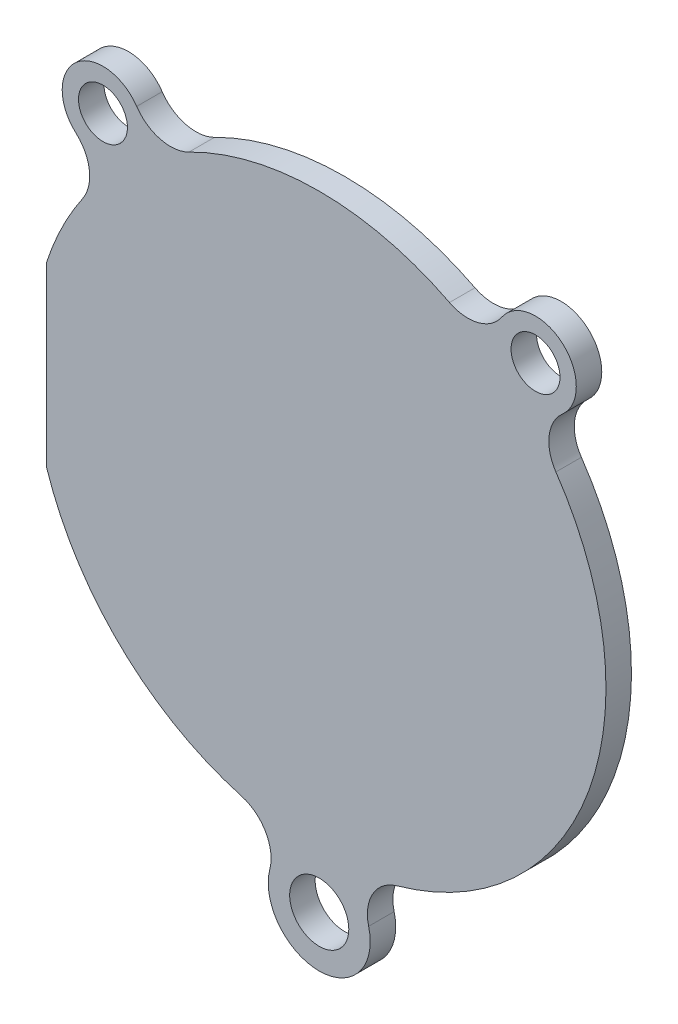
ISO-10303-21;
HEADER;
FILE_DESCRIPTION(('STEP AP214'),'2;1');
FILE_NAME('part.step','',(''),(''),'','','');
FILE_SCHEMA(('AUTOMOTIVE_DESIGN { 1 0 10303 214 1 1 1 1 }'));
ENDSEC;
DATA;
#1=APPLICATION_CONTEXT('core data for automotive mechanical design processes');
#2=APPLICATION_PROTOCOL_DEFINITION('international standard','automotive_design',2000,#1);
#3=PRODUCT_CONTEXT('',#1,'mechanical');
#4=PRODUCT('Part','Part','',(#3));
#5=PRODUCT_RELATED_PRODUCT_CATEGORY('part','',(#4));
#6=PRODUCT_DEFINITION_FORMATION('','',#4);
#7=PRODUCT_DEFINITION_CONTEXT('part definition',#1,'design');
#8=PRODUCT_DEFINITION('design','',#6,#7);
#9=PRODUCT_DEFINITION_SHAPE('','',#8);
#10=(LENGTH_UNIT() NAMED_UNIT(*) SI_UNIT(.MILLI.,.METRE.));
#11=(NAMED_UNIT(*) PLANE_ANGLE_UNIT() SI_UNIT($,.RADIAN.));
#12=(NAMED_UNIT(*) SI_UNIT($,.STERADIAN.) SOLID_ANGLE_UNIT());
#13=UNCERTAINTY_MEASURE_WITH_UNIT(LENGTH_MEASURE(1.E-05),#10,'distance_accuracy_value','');
#14=(GEOMETRIC_REPRESENTATION_CONTEXT(3) GLOBAL_UNCERTAINTY_ASSIGNED_CONTEXT((#13)) GLOBAL_UNIT_ASSIGNED_CONTEXT((#10,
#11,#12)) REPRESENTATION_CONTEXT('',''));
#15=CARTESIAN_POINT('',(0.,0.,0.));
#16=DIRECTION('',(0.,0.,1.));
#17=DIRECTION('',(1.,0.,0.));
#18=AXIS2_PLACEMENT_3D('',#15,#16,#17);
#19=CARTESIAN_POINT('',(-16.8382353602383,11.5166142635726,1.5875));
#20=DIRECTION('',(0.,0.,1.));
#21=DIRECTION('',(1.,0.,0.));
#22=AXIS2_PLACEMENT_3D('',#19,#20,#21);
#23=PLANE('',#22);
#24=CARTESIAN_POINT('',(-13.4706067024938,15.3199650524873,1.5875));
#25=DIRECTION('',(0.,0.,1.));
#26=DIRECTION('',(1.,0.,0.));
#27=AXIS2_PLACEMENT_3D('',#24,#25,#26);
#28=CIRCLE('',#27,1.524);
#29=CARTESIAN_POINT('',(-11.9466067024938,15.3199650524873,1.5875));
#30=VERTEX_POINT('',#29);
#31=EDGE_CURVE('E313',#30,#30,#28,.T.);
#32=ORIENTED_EDGE('',*,*,#31,.F.);
#33=EDGE_LOOP('',(#32));
#34=FACE_BOUND('',#33,.T.);
#35=CARTESIAN_POINT('',(-16.8382353602383,11.5166142635726,1.5875));
#36=DIRECTION('',(0.,0.,-1.));
#37=DIRECTION('',(1.,0.,0.));
#38=AXIS2_PLACEMENT_3D('',#35,#36,#37);
#39=CIRCLE('',#38,2.54);
#40=CARTESIAN_POINT('',(-15.1544210313661,13.41828965803,1.5875));
#41=VERTEX_POINT('',#40);
#42=CARTESIAN_POINT('',(-14.741706385558,10.0826804232836,1.5875));
#43=VERTEX_POINT('',#42);
#44=EDGE_CURVE('E193',#41,#43,#39,.T.);
#45=ORIENTED_EDGE('',*,*,#44,.T.);
#46=CARTESIAN_POINT('',(0.,0.,1.5875));
#47=DIRECTION('',(0.,0.,1.));
#48=DIRECTION('',(1.,0.,0.));
#49=AXIS2_PLACEMENT_3D('',#46,#47,#48);
#50=CIRCLE('',#49,17.8599650524873);
#51=CARTESIAN_POINT('',(-16.9840587441892,5.5245,1.5875));
#52=VERTEX_POINT('',#51);
#53=EDGE_CURVE('E111',#43,#52,#50,.T.);
#54=ORIENTED_EDGE('',*,*,#53,.T.);
#55=DIRECTION('',(0.,-1.,0.));
#56=VECTOR('',#55,1.);
#57=CARTESIAN_POINT('',(-16.9840587441893,-5.52449999999963,1.5875));
#58=LINE('',#57,#56);
#59=CARTESIAN_POINT('',(-16.9840587441893,-5.52449999999963,1.5875));
#60=VERTEX_POINT('',#59);
#61=EDGE_CURVE('E226',#52,#60,#58,.T.);
#62=ORIENTED_EDGE('',*,*,#61,.T.);
#63=CARTESIAN_POINT('',(0.,0.,1.5875));
#64=DIRECTION('',(0.,0.,1.));
#65=DIRECTION('',(1.,0.,0.));
#66=AXIS2_PLACEMENT_3D('',#63,#64,#65);
#67=CIRCLE('',#66,17.8599650524873);
#68=CARTESIAN_POINT('',(-4.85058295667171,-17.1886647723584,1.5875));
#69=VERTEX_POINT('',#68);
#70=EDGE_CURVE('E245',#60,#69,#67,.T.);
#71=ORIENTED_EDGE('',*,*,#70,.T.);
#72=CARTESIAN_POINT('',(-5.54042085242001,-19.6331941089771,1.5875));
#73=DIRECTION('',(0.,0.,-1.));
#74=DIRECTION('',(1.,0.,0.));
#75=AXIS2_PLACEMENT_3D('',#72,#73,#74);
#76=CIRCLE('',#75,2.54);
#77=CARTESIAN_POINT('',(-3.07801158467778,-20.2562034172039,1.5875));
#78=VERTEX_POINT('',#77);
#79=EDGE_CURVE('E242',#69,#78,#76,.T.);
#80=ORIENTED_EDGE('',*,*,#79,.T.);
#81=CARTESIAN_POINT('',(0.,-21.0349650524873,1.5875));
#82=DIRECTION('',(0.,0.,1.));
#83=DIRECTION('',(1.,0.,0.));
#84=AXIS2_PLACEMENT_3D('',#81,#82,#83);
#85=CIRCLE('',#84,3.175);
#86=CARTESIAN_POINT('',(3.07801158467779,-20.2562034172039,1.5875));
#87=VERTEX_POINT('',#86);
#88=EDGE_CURVE('E244',#78,#87,#85,.T.);
#89=ORIENTED_EDGE('',*,*,#88,.T.);
#90=CARTESIAN_POINT('',(5.54042085242001,-19.6331941089771,1.5875));
#91=DIRECTION('',(0.,0.,-1.));
#92=DIRECTION('',(1.,0.,0.));
#93=AXIS2_PLACEMENT_3D('',#90,#91,#92);
#94=CIRCLE('',#93,2.54);
#95=CARTESIAN_POINT('',(4.85058295667171,-17.1886647723584,1.5875));
#96=VERTEX_POINT('',#95);
#97=EDGE_CURVE('E247',#87,#96,#94,.T.);
#98=ORIENTED_EDGE('',*,*,#97,.T.);
#99=CARTESIAN_POINT('',(0.,0.,1.5875));
#100=DIRECTION('',(0.,0.,1.));
#101=DIRECTION('',(1.,0.,0.));
#102=AXIS2_PLACEMENT_3D('',#99,#100,#101);
#103=CIRCLE('',#102,17.8599650524873);
#104=CARTESIAN_POINT('',(14.741706385558,10.0826804232836,1.5875));
#105=VERTEX_POINT('',#104);
#106=EDGE_CURVE('E253',#96,#105,#103,.T.);
#107=ORIENTED_EDGE('',*,*,#106,.T.);
#108=CARTESIAN_POINT('',(16.8382353602383,11.5166142635726,1.5875));
#109=DIRECTION('',(0.,0.,-1.));
#110=DIRECTION('',(1.,0.,0.));
#111=AXIS2_PLACEMENT_3D('',#108,#109,#110);
#112=CIRCLE('',#111,2.54);
#113=CARTESIAN_POINT('',(15.1544210313661,13.41828965803,1.5875));
#114=VERTEX_POINT('',#113);
#115=EDGE_CURVE('E255',#105,#114,#112,.T.);
#116=ORIENTED_EDGE('',*,*,#115,.T.);
#117=CARTESIAN_POINT('',(13.4706067024938,15.3199650524873,1.5875));
#118=DIRECTION('',(0.,0.,1.));
#119=DIRECTION('',(1.,0.,0.));
#120=AXIS2_PLACEMENT_3D('',#117,#118,#119);
#121=CIRCLE('',#120,2.54);
#122=CARTESIAN_POINT('',(11.3691296286891,16.746637442447,1.5875));
#123=VERTEX_POINT('',#122);
#124=EDGE_CURVE('E257',#114,#123,#121,.T.);
#125=ORIENTED_EDGE('',*,*,#124,.T.);
#126=CARTESIAN_POINT('',(9.26765255488441,18.1733098324067,1.5875));
#127=DIRECTION('',(0.,0.,-1.));
#128=DIRECTION('',(1.,0.,0.));
#129=AXIS2_PLACEMENT_3D('',#126,#127,#128);
#130=CIRCLE('',#129,2.54);
#131=CARTESIAN_POINT('',(8.11373697567433,15.9105507122049,1.5875));
#132=VERTEX_POINT('',#131);
#133=EDGE_CURVE('E148',#123,#132,#130,.T.);
#134=ORIENTED_EDGE('',*,*,#133,.T.);
#135=CARTESIAN_POINT('',(0.,0.,1.5875));
#136=DIRECTION('',(0.,0.,1.));
#137=DIRECTION('',(1.,0.,0.));
#138=AXIS2_PLACEMENT_3D('',#135,#136,#137);
#139=CIRCLE('',#138,17.8599650524873);
#140=CARTESIAN_POINT('',(-8.11373697567433,15.9105507122049,1.5875));
#141=VERTEX_POINT('',#140);
#142=EDGE_CURVE('E142',#132,#141,#139,.T.);
#143=ORIENTED_EDGE('',*,*,#142,.T.);
#144=CARTESIAN_POINT('',(-9.26765255488441,18.1733098324067,1.5875));
#145=DIRECTION('',(0.,0.,-1.));
#146=DIRECTION('',(1.,0.,0.));
#147=AXIS2_PLACEMENT_3D('',#144,#145,#146);
#148=CIRCLE('',#147,2.54);
#149=CARTESIAN_POINT('',(-11.3691296286891,16.746637442447,1.5875));
#150=VERTEX_POINT('',#149);
#151=EDGE_CURVE('E146',#141,#150,#148,.T.);
#152=ORIENTED_EDGE('',*,*,#151,.T.);
#153=CARTESIAN_POINT('',(-13.4706067024938,15.3199650524873,1.5875));
#154=DIRECTION('',(0.,0.,1.));
#155=DIRECTION('',(1.,0.,0.));
#156=AXIS2_PLACEMENT_3D('',#153,#154,#155);
#157=CIRCLE('',#156,2.54);
#158=EDGE_CURVE('E50',#150,#41,#157,.T.);
#159=ORIENTED_EDGE('',*,*,#158,.T.);
#160=EDGE_LOOP('',(#45,#54,#62,#71,#80,#89,#98,#107,#116,#125,#134,#143,#152,#159));
#161=FACE_BOUND('',#160,.T.);
#162=CARTESIAN_POINT('',(0.,-21.0349650524873,1.5875));
#163=DIRECTION('',(0.,0.,1.));
#164=DIRECTION('',(1.,0.,0.));
#165=AXIS2_PLACEMENT_3D('',#162,#163,#164);
#166=CIRCLE('',#165,1.8415);
#167=CARTESIAN_POINT('',(1.8415,-21.0349650524873,1.5875));
#168=VERTEX_POINT('',#167);
#169=EDGE_CURVE('E170',#168,#168,#166,.T.);
#170=ORIENTED_EDGE('',*,*,#169,.F.);
#171=EDGE_LOOP('',(#170));
#172=FACE_BOUND('',#171,.T.);
#173=CARTESIAN_POINT('',(13.4706067024938,15.3199650524873,1.5875));
#174=DIRECTION('',(0.,0.,1.));
#175=DIRECTION('',(1.,0.,0.));
#176=AXIS2_PLACEMENT_3D('',#173,#174,#175);
#177=CIRCLE('',#176,1.524);
#178=CARTESIAN_POINT('',(14.9946067024938,15.3199650524873,1.5875));
#179=VERTEX_POINT('',#178);
#180=EDGE_CURVE('E304',#179,#179,#177,.T.);
#181=ORIENTED_EDGE('',*,*,#180,.F.);
#182=EDGE_LOOP('',(#181));
#183=FACE_BOUND('',#182,.T.);
#184=ADVANCED_FACE('F33',(#34,#161,#172,#183),#23,.T.);
#185=CARTESIAN_POINT('',(-16.8382353602383,11.5166142635726,0.));
#186=DIRECTION('',(0.,0.,1.));
#187=DIRECTION('',(1.,0.,0.));
#188=AXIS2_PLACEMENT_3D('',#185,#186,#187);
#189=PLANE('',#188);
#190=CARTESIAN_POINT('',(-13.4706067024938,15.3199650524873,0.));
#191=DIRECTION('',(0.,0.,1.));
#192=DIRECTION('',(1.,0.,0.));
#193=AXIS2_PLACEMENT_3D('',#190,#191,#192);
#194=CIRCLE('',#193,1.524);
#195=CARTESIAN_POINT('',(-11.9466067024938,15.3199650524873,0.));
#196=VERTEX_POINT('',#195);
#197=EDGE_CURVE('E310',#196,#196,#194,.T.);
#198=ORIENTED_EDGE('',*,*,#197,.T.);
#199=EDGE_LOOP('',(#198));
#200=FACE_BOUND('',#199,.T.);
#201=CARTESIAN_POINT('',(-16.8382353602383,11.5166142635726,0.));
#202=DIRECTION('',(0.,0.,-1.));
#203=DIRECTION('',(1.,0.,0.));
#204=AXIS2_PLACEMENT_3D('',#201,#202,#203);
#205=CIRCLE('',#204,2.54);
#206=CARTESIAN_POINT('',(-15.1544210313661,13.41828965803,0.));
#207=VERTEX_POINT('',#206);
#208=CARTESIAN_POINT('',(-14.741706385558,10.0826804232836,0.));
#209=VERTEX_POINT('',#208);
#210=EDGE_CURVE('E166',#207,#209,#205,.T.);
#211=ORIENTED_EDGE('',*,*,#210,.F.);
#212=CARTESIAN_POINT('',(-13.4706067024938,15.3199650524873,0.));
#213=DIRECTION('',(0.,0.,1.));
#214=DIRECTION('',(1.,0.,0.));
#215=AXIS2_PLACEMENT_3D('',#212,#213,#214);
#216=CIRCLE('',#215,2.54);
#217=CARTESIAN_POINT('',(-11.3691296286891,16.746637442447,0.));
#218=VERTEX_POINT('',#217);
#219=EDGE_CURVE('E103',#218,#207,#216,.T.);
#220=ORIENTED_EDGE('',*,*,#219,.F.);
#221=CARTESIAN_POINT('',(-9.26765255488441,18.1733098324067,0.));
#222=DIRECTION('',(0.,0.,-1.));
#223=DIRECTION('',(1.,0.,0.));
#224=AXIS2_PLACEMENT_3D('',#221,#222,#223);
#225=CIRCLE('',#224,2.54);
#226=CARTESIAN_POINT('',(-8.11373697567433,15.9105507122049,0.));
#227=VERTEX_POINT('',#226);
#228=EDGE_CURVE('E97',#227,#218,#225,.T.);
#229=ORIENTED_EDGE('',*,*,#228,.F.);
#230=CARTESIAN_POINT('',(0.,0.,0.));
#231=DIRECTION('',(0.,0.,1.));
#232=DIRECTION('',(1.,0.,0.));
#233=AXIS2_PLACEMENT_3D('',#230,#231,#232);
#234=CIRCLE('',#233,17.8599650524873);
#235=CARTESIAN_POINT('',(8.11373697567433,15.9105507122049,0.));
#236=VERTEX_POINT('',#235);
#237=EDGE_CURVE('E156',#236,#227,#234,.T.);
#238=ORIENTED_EDGE('',*,*,#237,.F.);
#239=CARTESIAN_POINT('',(9.26765255488441,18.1733098324067,0.));
#240=DIRECTION('',(0.,0.,-1.));
#241=DIRECTION('',(1.,0.,0.));
#242=AXIS2_PLACEMENT_3D('',#239,#240,#241);
#243=CIRCLE('',#242,2.54);
#244=CARTESIAN_POINT('',(11.3691296286891,16.746637442447,0.));
#245=VERTEX_POINT('',#244);
#246=EDGE_CURVE('E188',#245,#236,#243,.T.);
#247=ORIENTED_EDGE('',*,*,#246,.F.);
#248=CARTESIAN_POINT('',(13.4706067024938,15.3199650524873,0.));
#249=DIRECTION('',(0.,0.,1.));
#250=DIRECTION('',(1.,0.,0.));
#251=AXIS2_PLACEMENT_3D('',#248,#249,#250);
#252=CIRCLE('',#251,2.54);
#253=CARTESIAN_POINT('',(15.1544210313661,13.41828965803,0.));
#254=VERTEX_POINT('',#253);
#255=EDGE_CURVE('E186',#254,#245,#252,.T.);
#256=ORIENTED_EDGE('',*,*,#255,.F.);
#257=CARTESIAN_POINT('',(16.8382353602383,11.5166142635726,0.));
#258=DIRECTION('',(0.,0.,-1.));
#259=DIRECTION('',(1.,0.,0.));
#260=AXIS2_PLACEMENT_3D('',#257,#258,#259);
#261=CIRCLE('',#260,2.54);
#262=CARTESIAN_POINT('',(14.741706385558,10.0826804232836,0.));
#263=VERTEX_POINT('',#262);
#264=EDGE_CURVE('E184',#263,#254,#261,.T.);
#265=ORIENTED_EDGE('',*,*,#264,.F.);
#266=CARTESIAN_POINT('',(0.,0.,0.));
#267=DIRECTION('',(0.,0.,1.));
#268=DIRECTION('',(1.,0.,0.));
#269=AXIS2_PLACEMENT_3D('',#266,#267,#268);
#270=CIRCLE('',#269,17.8599650524873);
#271=CARTESIAN_POINT('',(4.85058295667171,-17.1886647723584,0.));
#272=VERTEX_POINT('',#271);
#273=EDGE_CURVE('E182',#272,#263,#270,.T.);
#274=ORIENTED_EDGE('',*,*,#273,.F.);
#275=CARTESIAN_POINT('',(5.54042085242001,-19.6331941089771,0.));
#276=DIRECTION('',(0.,0.,-1.));
#277=DIRECTION('',(1.,0.,0.));
#278=AXIS2_PLACEMENT_3D('',#275,#276,#277);
#279=CIRCLE('',#278,2.54);
#280=CARTESIAN_POINT('',(3.07801158467779,-20.2562034172039,0.));
#281=VERTEX_POINT('',#280);
#282=EDGE_CURVE('E180',#281,#272,#279,.T.);
#283=ORIENTED_EDGE('',*,*,#282,.F.);
#284=CARTESIAN_POINT('',(0.,-21.0349650524873,0.));
#285=DIRECTION('',(0.,0.,1.));
#286=DIRECTION('',(1.,0.,0.));
#287=AXIS2_PLACEMENT_3D('',#284,#285,#286);
#288=CIRCLE('',#287,3.175);
#289=CARTESIAN_POINT('',(-3.07801158467778,-20.2562034172039,0.));
#290=VERTEX_POINT('',#289);
#291=EDGE_CURVE('E178',#290,#281,#288,.T.);
#292=ORIENTED_EDGE('',*,*,#291,.F.);
#293=CARTESIAN_POINT('',(-5.54042085242001,-19.6331941089771,0.));
#294=DIRECTION('',(0.,0.,-1.));
#295=DIRECTION('',(1.,0.,0.));
#296=AXIS2_PLACEMENT_3D('',#293,#294,#295);
#297=CIRCLE('',#296,2.54);
#298=CARTESIAN_POINT('',(-4.85058295667171,-17.1886647723584,0.));
#299=VERTEX_POINT('',#298);
#300=EDGE_CURVE('E176',#299,#290,#297,.T.);
#301=ORIENTED_EDGE('',*,*,#300,.F.);
#302=CARTESIAN_POINT('',(0.,0.,0.));
#303=DIRECTION('',(0.,0.,1.));
#304=DIRECTION('',(1.,0.,0.));
#305=AXIS2_PLACEMENT_3D('',#302,#303,#304);
#306=CIRCLE('',#305,17.8599650524873);
#307=CARTESIAN_POINT('',(-16.9840587441893,-5.52449999999963,0.));
#308=VERTEX_POINT('',#307);
#309=EDGE_CURVE('E174',#308,#299,#306,.T.);
#310=ORIENTED_EDGE('',*,*,#309,.F.);
#311=DIRECTION('',(0.,-1.,0.));
#312=VECTOR('',#311,1.);
#313=CARTESIAN_POINT('',(-16.9840587441893,-5.52449999999963,0.));
#314=LINE('',#313,#312);
#315=CARTESIAN_POINT('',(-16.9840587441892,5.5245,0.));
#316=VERTEX_POINT('',#315);
#317=EDGE_CURVE('E172',#316,#308,#314,.T.);
#318=ORIENTED_EDGE('',*,*,#317,.F.);
#319=CARTESIAN_POINT('',(0.,0.,0.));
#320=DIRECTION('',(0.,0.,1.));
#321=DIRECTION('',(1.,0.,0.));
#322=AXIS2_PLACEMENT_3D('',#319,#320,#321);
#323=CIRCLE('',#322,17.8599650524873);
#324=EDGE_CURVE('E169',#209,#316,#323,.T.);
#325=ORIENTED_EDGE('',*,*,#324,.F.);
#326=EDGE_LOOP('',(#211,#220,#229,#238,#247,#256,#265,#274,#283,#292,#301,#310,#318,#325));
#327=FACE_BOUND('',#326,.T.);
#328=CARTESIAN_POINT('',(0.,-21.0349650524873,0.));
#329=DIRECTION('',(0.,0.,1.));
#330=DIRECTION('',(1.,0.,0.));
#331=AXIS2_PLACEMENT_3D('',#328,#329,#330);
#332=CIRCLE('',#331,1.8415);
#333=CARTESIAN_POINT('',(1.8415,-21.0349650524873,0.));
#334=VERTEX_POINT('',#333);
#335=EDGE_CURVE('E316',#334,#334,#332,.T.);
#336=ORIENTED_EDGE('',*,*,#335,.T.);
#337=EDGE_LOOP('',(#336));
#338=FACE_BOUND('',#337,.T.);
#339=CARTESIAN_POINT('',(13.4706067024938,15.3199650524873,0.));
#340=DIRECTION('',(0.,0.,1.));
#341=DIRECTION('',(1.,0.,0.));
#342=AXIS2_PLACEMENT_3D('',#339,#340,#341);
#343=CIRCLE('',#342,1.524);
#344=CARTESIAN_POINT('',(14.9946067024938,15.3199650524873,0.));
#345=VERTEX_POINT('',#344);
#346=EDGE_CURVE('E307',#345,#345,#343,.T.);
#347=ORIENTED_EDGE('',*,*,#346,.T.);
#348=EDGE_LOOP('',(#347));
#349=FACE_BOUND('',#348,.T.);
#350=ADVANCED_FACE('F230',(#200,#327,#338,#349),#189,.F.);
#351=CARTESIAN_POINT('',(-16.8382353602383,11.5166142635726,1.5875));
#352=DIRECTION('',(0.,0.,-1.));
#353=DIRECTION('',(-1.,0.,0.));
#354=AXIS2_PLACEMENT_3D('',#351,#352,#353);
#355=CYLINDRICAL_SURFACE('',#354,2.54);
#356=ORIENTED_EDGE('',*,*,#210,.T.);
#357=DIRECTION('',(0.,0.,-1.));
#358=VECTOR('',#357,1.);
#359=CARTESIAN_POINT('',(-14.741706385558,10.0826804232836,1.5875));
#360=LINE('',#359,#358);
#361=EDGE_CURVE('E11',#43,#209,#360,.T.);
#362=ORIENTED_EDGE('',*,*,#361,.F.);
#363=ORIENTED_EDGE('',*,*,#44,.F.);
#364=DIRECTION('',(0.,0.,-1.));
#365=VECTOR('',#364,1.);
#366=CARTESIAN_POINT('',(-15.1544210313661,13.41828965803,1.5875));
#367=LINE('',#366,#365);
#368=EDGE_CURVE('E162',#41,#207,#367,.T.);
#369=ORIENTED_EDGE('',*,*,#368,.T.);
#370=EDGE_LOOP('',(#356,#362,#363,#369));
#371=FACE_BOUND('',#370,.T.);
#372=ADVANCED_FACE('F35',(#371),#355,.F.);
#373=CARTESIAN_POINT('',(0.,0.,1.5875));
#374=DIRECTION('',(0.,0.,-1.));
#375=DIRECTION('',(-1.,0.,0.));
#376=AXIS2_PLACEMENT_3D('',#373,#374,#375);
#377=CYLINDRICAL_SURFACE('',#376,17.8599650524873);
#378=ORIENTED_EDGE('',*,*,#324,.T.);
#379=DIRECTION('',(0.,0.,-1.));
#380=VECTOR('',#379,1.);
#381=CARTESIAN_POINT('',(-16.9840587441892,5.5245,1.5875));
#382=LINE('',#381,#380);
#383=EDGE_CURVE('E42',#52,#316,#382,.T.);
#384=ORIENTED_EDGE('',*,*,#383,.F.);
#385=ORIENTED_EDGE('',*,*,#53,.F.);
#386=ORIENTED_EDGE('',*,*,#361,.T.);
#387=EDGE_LOOP('',(#378,#384,#385,#386));
#388=FACE_BOUND('',#387,.T.);
#389=ADVANCED_FACE('F437',(#388),#377,.T.);
#390=CARTESIAN_POINT('',(-16.9840587441893,-5.52449999999963,1.5875));
#391=DIRECTION('',(1.,0.,0.));
#392=DIRECTION('',(0.,1.,0.));
#393=AXIS2_PLACEMENT_3D('',#390,#391,#392);
#394=PLANE('',#393);
#395=ORIENTED_EDGE('',*,*,#317,.T.);
#396=DIRECTION('',(0.,0.,-1.));
#397=VECTOR('',#396,1.);
#398=CARTESIAN_POINT('',(-16.9840587441893,-5.52449999999963,1.5875));
#399=LINE('',#398,#397);
#400=EDGE_CURVE('E218',#60,#308,#399,.T.);
#401=ORIENTED_EDGE('',*,*,#400,.F.);
#402=ORIENTED_EDGE('',*,*,#61,.F.);
#403=ORIENTED_EDGE('',*,*,#383,.T.);
#404=EDGE_LOOP('',(#395,#401,#402,#403));
#405=FACE_BOUND('',#404,.T.);
#406=ADVANCED_FACE('F224',(#405),#394,.F.);
#407=CARTESIAN_POINT('',(0.,0.,1.5875));
#408=DIRECTION('',(0.,0.,-1.));
#409=DIRECTION('',(-1.,0.,0.));
#410=AXIS2_PLACEMENT_3D('',#407,#408,#409);
#411=CYLINDRICAL_SURFACE('',#410,17.8599650524873);
#412=ORIENTED_EDGE('',*,*,#309,.T.);
#413=DIRECTION('',(0.,0.,-1.));
#414=VECTOR('',#413,1.);
#415=CARTESIAN_POINT('',(-4.85058295667171,-17.1886647723584,1.5875));
#416=LINE('',#415,#414);
#417=EDGE_CURVE('E215',#69,#299,#416,.T.);
#418=ORIENTED_EDGE('',*,*,#417,.F.);
#419=ORIENTED_EDGE('',*,*,#70,.F.);
#420=ORIENTED_EDGE('',*,*,#400,.T.);
#421=EDGE_LOOP('',(#412,#418,#419,#420));
#422=FACE_BOUND('',#421,.T.);
#423=ADVANCED_FACE('F236',(#422),#411,.T.);
#424=CARTESIAN_POINT('',(-5.54042085242001,-19.6331941089771,1.5875));
#425=DIRECTION('',(0.,0.,-1.));
#426=DIRECTION('',(-1.,0.,0.));
#427=AXIS2_PLACEMENT_3D('',#424,#425,#426);
#428=CYLINDRICAL_SURFACE('',#427,2.54);
#429=ORIENTED_EDGE('',*,*,#300,.T.);
#430=DIRECTION('',(0.,0.,-1.));
#431=VECTOR('',#430,1.);
#432=CARTESIAN_POINT('',(-3.07801158467778,-20.2562034172039,1.5875));
#433=LINE('',#432,#431);
#434=EDGE_CURVE('E212',#78,#290,#433,.T.);
#435=ORIENTED_EDGE('',*,*,#434,.F.);
#436=ORIENTED_EDGE('',*,*,#79,.F.);
#437=ORIENTED_EDGE('',*,*,#417,.T.);
#438=EDGE_LOOP('',(#429,#435,#436,#437));
#439=FACE_BOUND('',#438,.T.);
#440=ADVANCED_FACE('F240',(#439),#428,.F.);
#441=CARTESIAN_POINT('',(0.,-21.0349650524873,1.5875));
#442=DIRECTION('',(0.,0.,-1.));
#443=DIRECTION('',(-1.,0.,0.));
#444=AXIS2_PLACEMENT_3D('',#441,#442,#443);
#445=CYLINDRICAL_SURFACE('',#444,3.175);
#446=ORIENTED_EDGE('',*,*,#291,.T.);
#447=DIRECTION('',(0.,0.,-1.));
#448=VECTOR('',#447,1.);
#449=CARTESIAN_POINT('',(3.07801158467779,-20.2562034172039,1.5875));
#450=LINE('',#449,#448);
#451=EDGE_CURVE('E209',#87,#281,#450,.T.);
#452=ORIENTED_EDGE('',*,*,#451,.F.);
#453=ORIENTED_EDGE('',*,*,#88,.F.);
#454=ORIENTED_EDGE('',*,*,#434,.T.);
#455=EDGE_LOOP('',(#446,#452,#453,#454));
#456=FACE_BOUND('',#455,.T.);
#457=ADVANCED_FACE('F402',(#456),#445,.T.);
#458=CARTESIAN_POINT('',(5.54042085242001,-19.6331941089771,1.5875));
#459=DIRECTION('',(0.,0.,-1.));
#460=DIRECTION('',(-1.,0.,0.));
#461=AXIS2_PLACEMENT_3D('',#458,#459,#460);
#462=CYLINDRICAL_SURFACE('',#461,2.54);
#463=ORIENTED_EDGE('',*,*,#282,.T.);
#464=DIRECTION('',(0.,0.,-1.));
#465=VECTOR('',#464,1.);
#466=CARTESIAN_POINT('',(4.85058295667171,-17.1886647723584,1.5875));
#467=LINE('',#466,#465);
#468=EDGE_CURVE('E206',#96,#272,#467,.T.);
#469=ORIENTED_EDGE('',*,*,#468,.F.);
#470=ORIENTED_EDGE('',*,*,#97,.F.);
#471=ORIENTED_EDGE('',*,*,#451,.T.);
#472=EDGE_LOOP('',(#463,#469,#470,#471));
#473=FACE_BOUND('',#472,.T.);
#474=ADVANCED_FACE('F392',(#473),#462,.F.);
#475=CARTESIAN_POINT('',(0.,0.,1.5875));
#476=DIRECTION('',(0.,0.,-1.));
#477=DIRECTION('',(-1.,0.,0.));
#478=AXIS2_PLACEMENT_3D('',#475,#476,#477);
#479=CYLINDRICAL_SURFACE('',#478,17.8599650524873);
#480=ORIENTED_EDGE('',*,*,#273,.T.);
#481=DIRECTION('',(0.,0.,-1.));
#482=VECTOR('',#481,1.);
#483=CARTESIAN_POINT('',(14.741706385558,10.0826804232836,1.5875));
#484=LINE('',#483,#482);
#485=EDGE_CURVE('E203',#105,#263,#484,.T.);
#486=ORIENTED_EDGE('',*,*,#485,.F.);
#487=ORIENTED_EDGE('',*,*,#106,.F.);
#488=ORIENTED_EDGE('',*,*,#468,.T.);
#489=EDGE_LOOP('',(#480,#486,#487,#488));
#490=FACE_BOUND('',#489,.T.);
#491=ADVANCED_FACE('F382',(#490),#479,.T.);
#492=CARTESIAN_POINT('',(16.8382353602383,11.5166142635726,1.5875));
#493=DIRECTION('',(0.,0.,-1.));
#494=DIRECTION('',(-1.,0.,0.));
#495=AXIS2_PLACEMENT_3D('',#492,#493,#494);
#496=CYLINDRICAL_SURFACE('',#495,2.54);
#497=ORIENTED_EDGE('',*,*,#264,.T.);
#498=DIRECTION('',(0.,0.,-1.));
#499=VECTOR('',#498,1.);
#500=CARTESIAN_POINT('',(15.1544210313661,13.41828965803,1.5875));
#501=LINE('',#500,#499);
#502=EDGE_CURVE('E200',#114,#254,#501,.T.);
#503=ORIENTED_EDGE('',*,*,#502,.F.);
#504=ORIENTED_EDGE('',*,*,#115,.F.);
#505=ORIENTED_EDGE('',*,*,#485,.T.);
#506=EDGE_LOOP('',(#497,#503,#504,#505));
#507=FACE_BOUND('',#506,.T.);
#508=ADVANCED_FACE('F373',(#507),#496,.F.);
#509=CARTESIAN_POINT('',(13.4706067024938,15.3199650524873,1.5875));
#510=DIRECTION('',(0.,0.,-1.));
#511=DIRECTION('',(-1.,0.,0.));
#512=AXIS2_PLACEMENT_3D('',#509,#510,#511);
#513=CYLINDRICAL_SURFACE('',#512,2.54);
#514=ORIENTED_EDGE('',*,*,#255,.T.);
#515=DIRECTION('',(0.,0.,-1.));
#516=VECTOR('',#515,1.);
#517=CARTESIAN_POINT('',(11.3691296286891,16.746637442447,1.5875));
#518=LINE('',#517,#516);
#519=EDGE_CURVE('E197',#123,#245,#518,.T.);
#520=ORIENTED_EDGE('',*,*,#519,.F.);
#521=ORIENTED_EDGE('',*,*,#124,.F.);
#522=ORIENTED_EDGE('',*,*,#502,.T.);
#523=EDGE_LOOP('',(#514,#520,#521,#522));
#524=FACE_BOUND('',#523,.T.);
#525=ADVANCED_FACE('F263',(#524),#513,.T.);
#526=CARTESIAN_POINT('',(9.26765255488441,18.1733098324067,1.5875));
#527=DIRECTION('',(0.,0.,-1.));
#528=DIRECTION('',(-1.,0.,0.));
#529=AXIS2_PLACEMENT_3D('',#526,#527,#528);
#530=CYLINDRICAL_SURFACE('',#529,2.54);
#531=ORIENTED_EDGE('',*,*,#246,.T.);
#532=DIRECTION('',(0.,0.,-1.));
#533=VECTOR('',#532,1.);
#534=CARTESIAN_POINT('',(8.11373697567433,15.9105507122049,1.5875));
#535=LINE('',#534,#533);
#536=EDGE_CURVE('E157',#132,#236,#535,.T.);
#537=ORIENTED_EDGE('',*,*,#536,.F.);
#538=ORIENTED_EDGE('',*,*,#133,.F.);
#539=ORIENTED_EDGE('',*,*,#519,.T.);
#540=EDGE_LOOP('',(#531,#537,#538,#539));
#541=FACE_BOUND('',#540,.T.);
#542=ADVANCED_FACE('F267',(#541),#530,.F.);
#543=CARTESIAN_POINT('',(0.,0.,1.5875));
#544=DIRECTION('',(0.,0.,-1.));
#545=DIRECTION('',(-1.,0.,0.));
#546=AXIS2_PLACEMENT_3D('',#543,#544,#545);
#547=CYLINDRICAL_SURFACE('',#546,17.8599650524873);
#548=ORIENTED_EDGE('',*,*,#237,.T.);
#549=DIRECTION('',(0.,0.,-1.));
#550=VECTOR('',#549,1.);
#551=CARTESIAN_POINT('',(-8.11373697567433,15.9105507122049,1.5875));
#552=LINE('',#551,#550);
#553=EDGE_CURVE('E153',#141,#227,#552,.T.);
#554=ORIENTED_EDGE('',*,*,#553,.F.);
#555=ORIENTED_EDGE('',*,*,#142,.F.);
#556=ORIENTED_EDGE('',*,*,#536,.T.);
#557=EDGE_LOOP('',(#548,#554,#555,#556));
#558=FACE_BOUND('',#557,.T.);
#559=ADVANCED_FACE('F154',(#558),#547,.T.);
#560=CARTESIAN_POINT('',(-9.26765255488441,18.1733098324067,1.5875));
#561=DIRECTION('',(0.,0.,-1.));
#562=DIRECTION('',(-1.,0.,0.));
#563=AXIS2_PLACEMENT_3D('',#560,#561,#562);
#564=CYLINDRICAL_SURFACE('',#563,2.54);
#565=ORIENTED_EDGE('',*,*,#228,.T.);
#566=DIRECTION('',(0.,0.,-1.));
#567=VECTOR('',#566,1.);
#568=CARTESIAN_POINT('',(-11.3691296286891,16.746637442447,1.5875));
#569=LINE('',#568,#567);
#570=EDGE_CURVE('E158',#150,#218,#569,.T.);
#571=ORIENTED_EDGE('',*,*,#570,.F.);
#572=ORIENTED_EDGE('',*,*,#151,.F.);
#573=ORIENTED_EDGE('',*,*,#553,.T.);
#574=EDGE_LOOP('',(#565,#571,#572,#573));
#575=FACE_BOUND('',#574,.T.);
#576=ADVANCED_FACE('F160',(#575),#564,.F.);
#577=CARTESIAN_POINT('',(-13.4706067024938,15.3199650524873,1.5875));
#578=DIRECTION('',(0.,0.,-1.));
#579=DIRECTION('',(-1.,0.,0.));
#580=AXIS2_PLACEMENT_3D('',#577,#578,#579);
#581=CYLINDRICAL_SURFACE('',#580,2.54);
#582=ORIENTED_EDGE('',*,*,#219,.T.);
#583=ORIENTED_EDGE('',*,*,#368,.F.);
#584=ORIENTED_EDGE('',*,*,#158,.F.);
#585=ORIENTED_EDGE('',*,*,#570,.T.);
#586=EDGE_LOOP('',(#582,#583,#584,#585));
#587=FACE_BOUND('',#586,.T.);
#588=ADVANCED_FACE('F271',(#587),#581,.T.);
#589=CARTESIAN_POINT('',(0.,-21.0349650524873,1.5875));
#590=DIRECTION('',(0.,0.,-1.));
#591=DIRECTION('',(-1.,0.,0.));
#592=AXIS2_PLACEMENT_3D('',#589,#590,#591);
#593=CYLINDRICAL_SURFACE('',#592,1.8415);
#594=ORIENTED_EDGE('',*,*,#169,.T.);
#595=EDGE_LOOP('',(#594));
#596=FACE_BOUND('',#595,.T.);
#597=ORIENTED_EDGE('',*,*,#335,.F.);
#598=EDGE_LOOP('',(#597));
#599=FACE_BOUND('',#598,.T.);
#600=ADVANCED_FACE('F273',(#596,#599),#593,.F.);
#601=CARTESIAN_POINT('',(-13.4706067024938,15.3199650524873,1.5875));
#602=DIRECTION('',(0.,0.,-1.));
#603=DIRECTION('',(-1.,0.,0.));
#604=AXIS2_PLACEMENT_3D('',#601,#602,#603);
#605=CYLINDRICAL_SURFACE('',#604,1.524);
#606=ORIENTED_EDGE('',*,*,#31,.T.);
#607=EDGE_LOOP('',(#606));
#608=FACE_BOUND('',#607,.T.);
#609=ORIENTED_EDGE('',*,*,#197,.F.);
#610=EDGE_LOOP('',(#609));
#611=FACE_BOUND('',#610,.T.);
#612=ADVANCED_FACE('F279',(#608,#611),#605,.F.);
#613=CARTESIAN_POINT('',(13.4706067024938,15.3199650524873,1.5875));
#614=DIRECTION('',(0.,0.,-1.));
#615=DIRECTION('',(-1.,0.,0.));
#616=AXIS2_PLACEMENT_3D('',#613,#614,#615);
#617=CYLINDRICAL_SURFACE('',#616,1.524);
#618=ORIENTED_EDGE('',*,*,#180,.T.);
#619=EDGE_LOOP('',(#618));
#620=FACE_BOUND('',#619,.T.);
#621=ORIENTED_EDGE('',*,*,#346,.F.);
#622=EDGE_LOOP('',(#621));
#623=FACE_BOUND('',#622,.T.);
#624=ADVANCED_FACE('F295',(#620,#623),#617,.F.);
#625=CLOSED_SHELL('',(#184,#350,#372,#389,#406,#423,#440,#457,#474,#491,#508,#525,#542,#559,
#576,#588,#600,#612,#624));
#626=MANIFOLD_SOLID_BREP('B2',#625);
#627=ADVANCED_BREP_SHAPE_REPRESENTATION('',(#18,#626),#14);
#628=SHAPE_DEFINITION_REPRESENTATION(#9,#627);
ENDSEC;
END-ISO-10303-21;
